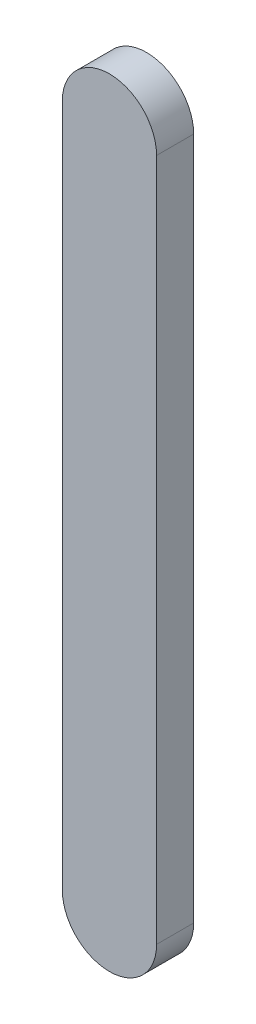
ISO-10303-21;
HEADER;
FILE_DESCRIPTION(('STEP AP214'),'2;1');
FILE_NAME('part.step','',(''),(''),'','','');
FILE_SCHEMA(('AUTOMOTIVE_DESIGN { 1 0 10303 214 1 1 1 1 }'));
ENDSEC;
DATA;
#1=APPLICATION_CONTEXT('core data for automotive mechanical design processes');
#2=APPLICATION_PROTOCOL_DEFINITION('international standard','automotive_design',2000,#1);
#3=PRODUCT_CONTEXT('',#1,'mechanical');
#4=PRODUCT('Part','Part','',(#3));
#5=PRODUCT_RELATED_PRODUCT_CATEGORY('part','',(#4));
#6=PRODUCT_DEFINITION_FORMATION('','',#4);
#7=PRODUCT_DEFINITION_CONTEXT('part definition',#1,'design');
#8=PRODUCT_DEFINITION('design','',#6,#7);
#9=PRODUCT_DEFINITION_SHAPE('','',#8);
#10=(LENGTH_UNIT() NAMED_UNIT(*) SI_UNIT(.MILLI.,.METRE.));
#11=(NAMED_UNIT(*) PLANE_ANGLE_UNIT() SI_UNIT($,.RADIAN.));
#12=(NAMED_UNIT(*) SI_UNIT($,.STERADIAN.) SOLID_ANGLE_UNIT());
#13=UNCERTAINTY_MEASURE_WITH_UNIT(LENGTH_MEASURE(1.E-05),#10,'distance_accuracy_value','');
#14=(GEOMETRIC_REPRESENTATION_CONTEXT(3) GLOBAL_UNCERTAINTY_ASSIGNED_CONTEXT((#13)) GLOBAL_UNIT_ASSIGNED_CONTEXT((#10,
#11,#12)) REPRESENTATION_CONTEXT('',''));
#15=CARTESIAN_POINT('',(0.,0.,0.));
#16=DIRECTION('',(0.,0.,1.));
#17=DIRECTION('',(1.,0.,0.));
#18=AXIS2_PLACEMENT_3D('',#15,#16,#17);
#19=CARTESIAN_POINT('',(148.209,61.341,0.));
#20=DIRECTION('',(-1.,0.,0.));
#21=DIRECTION('',(0.,1.,0.));
#22=AXIS2_PLACEMENT_3D('',#19,#20,#21);
#23=PLANE('',#22);
#24=DIRECTION('',(0.,1.,0.));
#25=VECTOR('',#24,1.);
#26=CARTESIAN_POINT('',(148.209,61.341,0.1999996));
#27=LINE('',#26,#25);
#28=CARTESIAN_POINT('',(148.209,61.341,0.1999996));
#29=VERTEX_POINT('',#28);
#30=CARTESIAN_POINT('',(148.209,65.024,0.1999996));
#31=VERTEX_POINT('',#30);
#32=EDGE_CURVE('E11',#29,#31,#27,.T.);
#33=ORIENTED_EDGE('',*,*,#32,.F.);
#34=DIRECTION('',(0.,0.,1.));
#35=VECTOR('',#34,1.);
#36=CARTESIAN_POINT('',(148.209,61.341,0.));
#37=LINE('',#36,#35);
#38=CARTESIAN_POINT('',(148.209,61.341,0.));
#39=VERTEX_POINT('',#38);
#40=EDGE_CURVE('E24',#39,#29,#37,.T.);
#41=ORIENTED_EDGE('',*,*,#40,.F.);
#42=DIRECTION('',(0.,1.,0.));
#43=VECTOR('',#42,1.);
#44=CARTESIAN_POINT('',(148.209,61.341,0.));
#45=LINE('',#44,#43);
#46=CARTESIAN_POINT('',(148.209,65.024,0.));
#47=VERTEX_POINT('',#46);
#48=EDGE_CURVE('E75',#39,#47,#45,.T.);
#49=ORIENTED_EDGE('',*,*,#48,.T.);
#50=DIRECTION('',(0.,0.,1.));
#51=VECTOR('',#50,1.);
#52=CARTESIAN_POINT('',(148.209,65.024,0.));
#53=LINE('',#52,#51);
#54=EDGE_CURVE('E37',#47,#31,#53,.T.);
#55=ORIENTED_EDGE('',*,*,#54,.T.);
#56=EDGE_LOOP('',(#33,#41,#49,#55));
#57=FACE_BOUND('',#56,.T.);
#58=ADVANCED_FACE('F17',(#57),#23,.F.);
#59=CARTESIAN_POINT('',(147.955,65.024,0.));
#60=DIRECTION('',(0.,0.,-1.));
#61=DIRECTION('',(1.,0.,0.));
#62=AXIS2_PLACEMENT_3D('',#59,#60,#61);
#63=CYLINDRICAL_SURFACE('',#62,0.254);
#64=CARTESIAN_POINT('',(147.955,65.024,0.1999996));
#65=DIRECTION('',(0.,0.,1.));
#66=DIRECTION('',(1.,0.,0.));
#67=AXIS2_PLACEMENT_3D('',#64,#65,#66);
#68=CIRCLE('',#67,0.254);
#69=CARTESIAN_POINT('',(147.701,65.024,0.1999996));
#70=VERTEX_POINT('',#69);
#71=EDGE_CURVE('E83',#31,#70,#68,.T.);
#72=ORIENTED_EDGE('',*,*,#71,.F.);
#73=ORIENTED_EDGE('',*,*,#54,.F.);
#74=CARTESIAN_POINT('',(147.955,65.024,0.));
#75=DIRECTION('',(0.,0.,1.));
#76=DIRECTION('',(1.,0.,0.));
#77=AXIS2_PLACEMENT_3D('',#74,#75,#76);
#78=CIRCLE('',#77,0.254);
#79=CARTESIAN_POINT('',(147.701,65.024,0.));
#80=VERTEX_POINT('',#79);
#81=EDGE_CURVE('E81',#47,#80,#78,.T.);
#82=ORIENTED_EDGE('',*,*,#81,.T.);
#83=DIRECTION('',(0.,0.,1.));
#84=VECTOR('',#83,1.);
#85=CARTESIAN_POINT('',(147.701,65.024,0.));
#86=LINE('',#85,#84);
#87=EDGE_CURVE('E67',#80,#70,#86,.T.);
#88=ORIENTED_EDGE('',*,*,#87,.T.);
#89=EDGE_LOOP('',(#72,#73,#82,#88));
#90=FACE_BOUND('',#89,.T.);
#91=ADVANCED_FACE('F89',(#90),#63,.T.);
#92=CARTESIAN_POINT('',(147.701,65.024,0.));
#93=DIRECTION('',(1.,0.,0.));
#94=DIRECTION('',(0.,-1.,0.));
#95=AXIS2_PLACEMENT_3D('',#92,#93,#94);
#96=PLANE('',#95);
#97=DIRECTION('',(0.,-1.,0.));
#98=VECTOR('',#97,1.);
#99=CARTESIAN_POINT('',(147.701,65.024,0.1999996));
#100=LINE('',#99,#98);
#101=CARTESIAN_POINT('',(147.701,61.341,0.1999996));
#102=VERTEX_POINT('',#101);
#103=EDGE_CURVE('E71',#70,#102,#100,.T.);
#104=ORIENTED_EDGE('',*,*,#103,.F.);
#105=ORIENTED_EDGE('',*,*,#87,.F.);
#106=DIRECTION('',(0.,-1.,0.));
#107=VECTOR('',#106,1.);
#108=CARTESIAN_POINT('',(147.701,65.024,0.));
#109=LINE('',#108,#107);
#110=CARTESIAN_POINT('',(147.701,61.341,0.));
#111=VERTEX_POINT('',#110);
#112=EDGE_CURVE('E63',#80,#111,#109,.T.);
#113=ORIENTED_EDGE('',*,*,#112,.T.);
#114=DIRECTION('',(0.,0.,1.));
#115=VECTOR('',#114,1.);
#116=CARTESIAN_POINT('',(147.701,61.341,0.));
#117=LINE('',#116,#115);
#118=EDGE_CURVE('E53',#111,#102,#117,.T.);
#119=ORIENTED_EDGE('',*,*,#118,.T.);
#120=EDGE_LOOP('',(#104,#105,#113,#119));
#121=FACE_BOUND('',#120,.T.);
#122=ADVANCED_FACE('F66',(#121),#96,.F.);
#123=CARTESIAN_POINT('',(147.955,61.341,0.));
#124=DIRECTION('',(0.,0.,-1.));
#125=DIRECTION('',(-1.,0.,0.));
#126=AXIS2_PLACEMENT_3D('',#123,#124,#125);
#127=CYLINDRICAL_SURFACE('',#126,0.254);
#128=CARTESIAN_POINT('',(147.955,61.341,0.1999996));
#129=DIRECTION('',(0.,0.,1.));
#130=DIRECTION('',(-1.,0.,0.));
#131=AXIS2_PLACEMENT_3D('',#128,#129,#130);
#132=CIRCLE('',#131,0.254);
#133=EDGE_CURVE('E59',#102,#29,#132,.T.);
#134=ORIENTED_EDGE('',*,*,#133,.F.);
#135=ORIENTED_EDGE('',*,*,#118,.F.);
#136=CARTESIAN_POINT('',(147.955,61.341,0.));
#137=DIRECTION('',(0.,0.,1.));
#138=DIRECTION('',(-1.,0.,0.));
#139=AXIS2_PLACEMENT_3D('',#136,#137,#138);
#140=CIRCLE('',#139,0.254);
#141=EDGE_CURVE('E57',#111,#39,#140,.T.);
#142=ORIENTED_EDGE('',*,*,#141,.T.);
#143=ORIENTED_EDGE('',*,*,#40,.T.);
#144=EDGE_LOOP('',(#134,#135,#142,#143));
#145=FACE_BOUND('',#144,.T.);
#146=ADVANCED_FACE('F55',(#145),#127,.T.);
#147=CARTESIAN_POINT('',(148.209,61.341,0.));
#148=DIRECTION('',(0.,0.,-1.));
#149=DIRECTION('',(-1.,0.,0.));
#150=AXIS2_PLACEMENT_3D('',#147,#148,#149);
#151=PLANE('',#150);
#152=ORIENTED_EDGE('',*,*,#141,.F.);
#153=ORIENTED_EDGE('',*,*,#112,.F.);
#154=ORIENTED_EDGE('',*,*,#81,.F.);
#155=ORIENTED_EDGE('',*,*,#48,.F.);
#156=EDGE_LOOP('',(#152,#153,#154,#155));
#157=FACE_BOUND('',#156,.T.);
#158=ADVANCED_FACE('F74',(#157),#151,.T.);
#159=CARTESIAN_POINT('',(148.209,61.341,0.1999996));
#160=DIRECTION('',(0.,0.,-1.));
#161=DIRECTION('',(-1.,0.,0.));
#162=AXIS2_PLACEMENT_3D('',#159,#160,#161);
#163=PLANE('',#162);
#164=ORIENTED_EDGE('',*,*,#32,.T.);
#165=ORIENTED_EDGE('',*,*,#71,.T.);
#166=ORIENTED_EDGE('',*,*,#103,.T.);
#167=ORIENTED_EDGE('',*,*,#133,.T.);
#168=EDGE_LOOP('',(#164,#165,#166,#167));
#169=FACE_BOUND('',#168,.T.);
#170=ADVANCED_FACE('F91',(#169),#163,.F.);
#171=CLOSED_SHELL('',(#58,#91,#122,#146,#158,#170));
#172=MANIFOLD_SOLID_BREP('B1',#171);
#173=ADVANCED_BREP_SHAPE_REPRESENTATION('',(#18,#172),#14);
#174=SHAPE_DEFINITION_REPRESENTATION(#9,#173);
ENDSEC;
END-ISO-10303-21;
